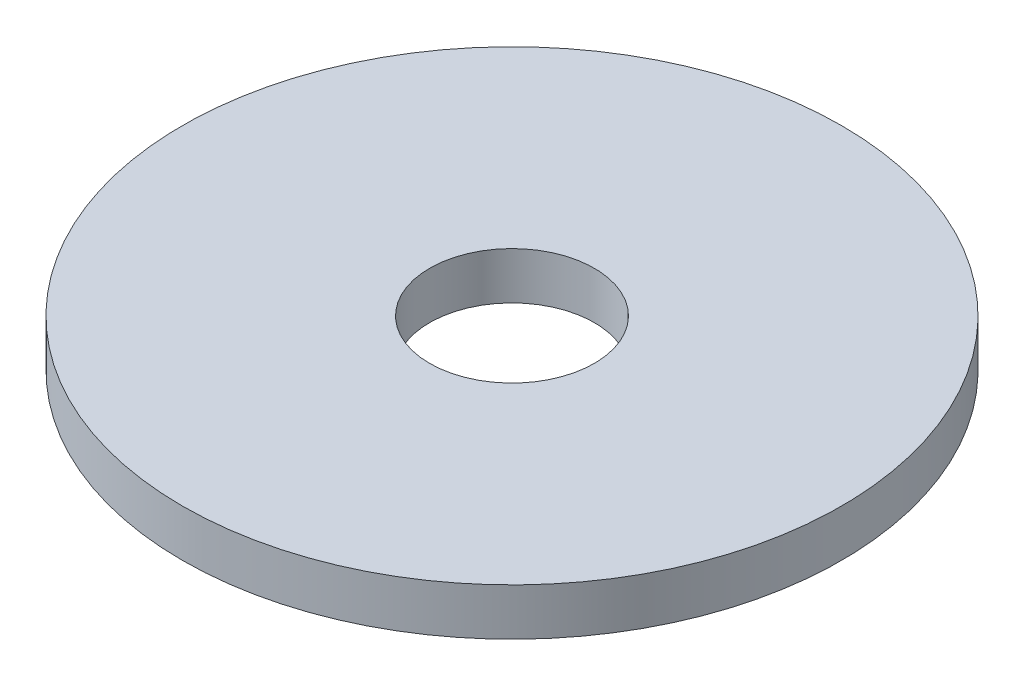
ISO-10303-21;
HEADER;
FILE_DESCRIPTION(('STEP AP214'),'2;1');
FILE_NAME('part.step','',(''),(''),'','','');
FILE_SCHEMA(('AUTOMOTIVE_DESIGN { 1 0 10303 214 1 1 1 1 }'));
ENDSEC;
DATA;
#1=APPLICATION_CONTEXT('core data for automotive mechanical design processes');
#2=APPLICATION_PROTOCOL_DEFINITION('international standard','automotive_design',2000,#1);
#3=PRODUCT_CONTEXT('',#1,'mechanical');
#4=PRODUCT('Part','Part','',(#3));
#5=PRODUCT_RELATED_PRODUCT_CATEGORY('part','',(#4));
#6=PRODUCT_DEFINITION_FORMATION('','',#4);
#7=PRODUCT_DEFINITION_CONTEXT('part definition',#1,'design');
#8=PRODUCT_DEFINITION('design','',#6,#7);
#9=PRODUCT_DEFINITION_SHAPE('','',#8);
#10=(LENGTH_UNIT() NAMED_UNIT(*) SI_UNIT(.MILLI.,.METRE.));
#11=(NAMED_UNIT(*) PLANE_ANGLE_UNIT() SI_UNIT($,.RADIAN.));
#12=(NAMED_UNIT(*) SI_UNIT($,.STERADIAN.) SOLID_ANGLE_UNIT());
#13=UNCERTAINTY_MEASURE_WITH_UNIT(LENGTH_MEASURE(1.E-05),#10,'distance_accuracy_value','');
#14=(GEOMETRIC_REPRESENTATION_CONTEXT(3) GLOBAL_UNCERTAINTY_ASSIGNED_CONTEXT((#13)) GLOBAL_UNIT_ASSIGNED_CONTEXT((#10,
#11,#12)) REPRESENTATION_CONTEXT('',''));
#15=CARTESIAN_POINT('',(0.,0.,0.));
#16=DIRECTION('',(0.,0.,1.));
#17=DIRECTION('',(1.,0.,0.));
#18=AXIS2_PLACEMENT_3D('',#15,#16,#17);
#19=CARTESIAN_POINT('',(0.,5.,0.));
#20=DIRECTION('',(0.,1.,0.));
#21=DIRECTION('',(0.,0.,1.));
#22=AXIS2_PLACEMENT_3D('',#19,#20,#21);
#23=PLANE('',#22);
#24=CARTESIAN_POINT('',(0.,5.,0.));
#25=DIRECTION('',(0.,1.,0.));
#26=DIRECTION('',(0.,0.,1.));
#27=AXIS2_PLACEMENT_3D('',#24,#25,#26);
#28=CIRCLE('',#27,70.);
#29=CARTESIAN_POINT('',(0.,5.,70.));
#30=VERTEX_POINT('',#29);
#31=EDGE_CURVE('E10',#30,#30,#28,.T.);
#32=ORIENTED_EDGE('',*,*,#31,.T.);
#33=EDGE_LOOP('',(#32));
#34=FACE_BOUND('',#33,.T.);
#35=CARTESIAN_POINT('',(0.,5.,0.));
#36=DIRECTION('',(0.,1.,0.));
#37=DIRECTION('',(0.,0.,1.));
#38=AXIS2_PLACEMENT_3D('',#35,#36,#37);
#39=CIRCLE('',#38,17.5);
#40=CARTESIAN_POINT('',(0.,5.,17.5));
#41=VERTEX_POINT('',#40);
#42=EDGE_CURVE('E42',#41,#41,#39,.T.);
#43=ORIENTED_EDGE('',*,*,#42,.F.);
#44=EDGE_LOOP('',(#43));
#45=FACE_BOUND('',#44,.T.);
#46=ADVANCED_FACE('F31',(#34,#45),#23,.T.);
#47=CARTESIAN_POINT('',(0.,-5.,0.));
#48=DIRECTION('',(0.,1.,0.));
#49=DIRECTION('',(0.,0.,1.));
#50=AXIS2_PLACEMENT_3D('',#47,#48,#49);
#51=PLANE('',#50);
#52=CARTESIAN_POINT('',(0.,-5.,0.));
#53=DIRECTION('',(0.,1.,0.));
#54=DIRECTION('',(0.,0.,1.));
#55=AXIS2_PLACEMENT_3D('',#52,#53,#54);
#56=CIRCLE('',#55,70.);
#57=CARTESIAN_POINT('',(0.,-5.,70.));
#58=VERTEX_POINT('',#57);
#59=EDGE_CURVE('E35',#58,#58,#56,.T.);
#60=ORIENTED_EDGE('',*,*,#59,.F.);
#61=EDGE_LOOP('',(#60));
#62=FACE_BOUND('',#61,.T.);
#63=CARTESIAN_POINT('',(0.,-5.,0.));
#64=DIRECTION('',(0.,1.,0.));
#65=DIRECTION('',(0.,0.,1.));
#66=AXIS2_PLACEMENT_3D('',#63,#64,#65);
#67=CIRCLE('',#66,17.5);
#68=CARTESIAN_POINT('',(0.,-5.,17.5));
#69=VERTEX_POINT('',#68);
#70=EDGE_CURVE('E44',#69,#69,#67,.T.);
#71=ORIENTED_EDGE('',*,*,#70,.T.);
#72=EDGE_LOOP('',(#71));
#73=FACE_BOUND('',#72,.T.);
#74=ADVANCED_FACE('F54',(#62,#73),#51,.F.);
#75=CARTESIAN_POINT('',(0.,5.,0.));
#76=DIRECTION('',(0.,-1.,0.));
#77=DIRECTION('',(0.,0.,-1.));
#78=AXIS2_PLACEMENT_3D('',#75,#76,#77);
#79=CYLINDRICAL_SURFACE('',#78,70.);
#80=ORIENTED_EDGE('',*,*,#31,.F.);
#81=EDGE_LOOP('',(#80));
#82=FACE_BOUND('',#81,.T.);
#83=ORIENTED_EDGE('',*,*,#59,.T.);
#84=EDGE_LOOP('',(#83));
#85=FACE_BOUND('',#84,.T.);
#86=ADVANCED_FACE('F33',(#82,#85),#79,.T.);
#87=CARTESIAN_POINT('',(0.,5.,0.));
#88=DIRECTION('',(0.,-1.,0.));
#89=DIRECTION('',(0.,0.,-1.));
#90=AXIS2_PLACEMENT_3D('',#87,#88,#89);
#91=CYLINDRICAL_SURFACE('',#90,17.5);
#92=ORIENTED_EDGE('',*,*,#42,.T.);
#93=EDGE_LOOP('',(#92));
#94=FACE_BOUND('',#93,.T.);
#95=ORIENTED_EDGE('',*,*,#70,.F.);
#96=EDGE_LOOP('',(#95));
#97=FACE_BOUND('',#96,.T.);
#98=ADVANCED_FACE('F50',(#94,#97),#91,.F.);
#99=CLOSED_SHELL('',(#46,#74,#86,#98));
#100=MANIFOLD_SOLID_BREP('B2',#99);
#101=ADVANCED_BREP_SHAPE_REPRESENTATION('',(#18,#100),#14);
#102=SHAPE_DEFINITION_REPRESENTATION(#9,#101);
ENDSEC;
END-ISO-10303-21;
